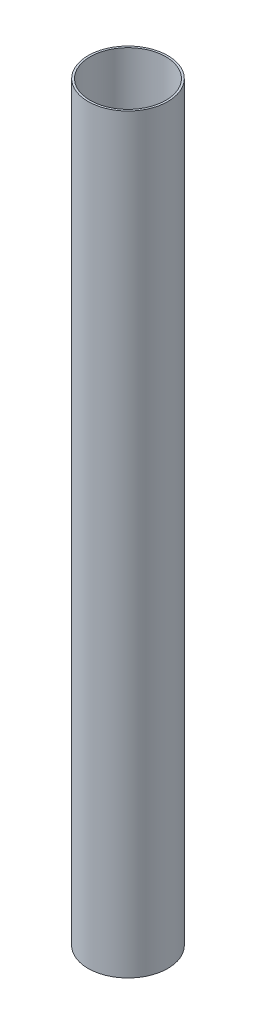
ISO-10303-21;
HEADER;
FILE_DESCRIPTION(('STEP AP214'),'2;1');
FILE_NAME('part.step','',(''),(''),'','','');
FILE_SCHEMA(('AUTOMOTIVE_DESIGN { 1 0 10303 214 1 1 1 1 }'));
ENDSEC;
DATA;
#1=APPLICATION_CONTEXT('core data for automotive mechanical design processes');
#2=APPLICATION_PROTOCOL_DEFINITION('international standard','automotive_design',2000,#1);
#3=PRODUCT_CONTEXT('',#1,'mechanical');
#4=PRODUCT('Part','Part','',(#3));
#5=PRODUCT_RELATED_PRODUCT_CATEGORY('part','',(#4));
#6=PRODUCT_DEFINITION_FORMATION('','',#4);
#7=PRODUCT_DEFINITION_CONTEXT('part definition',#1,'design');
#8=PRODUCT_DEFINITION('design','',#6,#7);
#9=PRODUCT_DEFINITION_SHAPE('','',#8);
#10=(LENGTH_UNIT() NAMED_UNIT(*) SI_UNIT(.MILLI.,.METRE.));
#11=(NAMED_UNIT(*) PLANE_ANGLE_UNIT() SI_UNIT($,.RADIAN.));
#12=(NAMED_UNIT(*) SI_UNIT($,.STERADIAN.) SOLID_ANGLE_UNIT());
#13=UNCERTAINTY_MEASURE_WITH_UNIT(LENGTH_MEASURE(1.E-05),#10,'distance_accuracy_value','');
#14=(GEOMETRIC_REPRESENTATION_CONTEXT(3) GLOBAL_UNCERTAINTY_ASSIGNED_CONTEXT((#13)) GLOBAL_UNIT_ASSIGNED_CONTEXT((#10,
#11,#12)) REPRESENTATION_CONTEXT('',''));
#15=CARTESIAN_POINT('',(0.,0.,0.));
#16=DIRECTION('',(0.,0.,1.));
#17=DIRECTION('',(1.,0.,0.));
#18=AXIS2_PLACEMENT_3D('',#15,#16,#17);
#19=CARTESIAN_POINT('',(0.,620.,0.));
#20=DIRECTION('',(0.,1.,0.));
#21=DIRECTION('',(0.,0.,1.));
#22=AXIS2_PLACEMENT_3D('',#19,#20,#21);
#23=PLANE('',#22);
#24=CARTESIAN_POINT('',(0.,620.,0.));
#25=DIRECTION('',(0.,1.,0.));
#26=DIRECTION('',(0.,0.,1.));
#27=AXIS2_PLACEMENT_3D('',#24,#25,#26);
#28=CIRCLE('',#27,32.9);
#29=CARTESIAN_POINT('',(0.,620.,32.9));
#30=VERTEX_POINT('',#29);
#31=EDGE_CURVE('E10',#30,#30,#28,.T.);
#32=ORIENTED_EDGE('',*,*,#31,.T.);
#33=EDGE_LOOP('',(#32));
#34=FACE_BOUND('',#33,.T.);
#35=CARTESIAN_POINT('',(0.,620.,0.));
#36=DIRECTION('',(0.,1.,0.));
#37=DIRECTION('',(0.,0.,1.));
#38=AXIS2_PLACEMENT_3D('',#35,#36,#37);
#39=CIRCLE('',#38,31.25);
#40=CARTESIAN_POINT('',(0.,620.,31.25));
#41=VERTEX_POINT('',#40);
#42=EDGE_CURVE('E42',#41,#41,#39,.T.);
#43=ORIENTED_EDGE('',*,*,#42,.F.);
#44=EDGE_LOOP('',(#43));
#45=FACE_BOUND('',#44,.T.);
#46=ADVANCED_FACE('F31',(#34,#45),#23,.T.);
#47=CARTESIAN_POINT('',(0.,0.,0.));
#48=DIRECTION('',(0.,1.,0.));
#49=DIRECTION('',(0.,0.,1.));
#50=AXIS2_PLACEMENT_3D('',#47,#48,#49);
#51=PLANE('',#50);
#52=CARTESIAN_POINT('',(0.,0.,0.));
#53=DIRECTION('',(0.,1.,0.));
#54=DIRECTION('',(0.,0.,1.));
#55=AXIS2_PLACEMENT_3D('',#52,#53,#54);
#56=CIRCLE('',#55,32.9);
#57=CARTESIAN_POINT('',(0.,0.,32.9));
#58=VERTEX_POINT('',#57);
#59=EDGE_CURVE('E35',#58,#58,#56,.T.);
#60=ORIENTED_EDGE('',*,*,#59,.F.);
#61=EDGE_LOOP('',(#60));
#62=FACE_BOUND('',#61,.T.);
#63=CARTESIAN_POINT('',(0.,0.,0.));
#64=DIRECTION('',(0.,1.,0.));
#65=DIRECTION('',(0.,0.,1.));
#66=AXIS2_PLACEMENT_3D('',#63,#64,#65);
#67=CIRCLE('',#66,31.25);
#68=CARTESIAN_POINT('',(0.,0.,31.25));
#69=VERTEX_POINT('',#68);
#70=EDGE_CURVE('E44',#69,#69,#67,.T.);
#71=ORIENTED_EDGE('',*,*,#70,.T.);
#72=EDGE_LOOP('',(#71));
#73=FACE_BOUND('',#72,.T.);
#74=ADVANCED_FACE('F54',(#62,#73),#51,.F.);
#75=CARTESIAN_POINT('',(0.,620.,0.));
#76=DIRECTION('',(0.,-1.,0.));
#77=DIRECTION('',(0.,0.,-1.));
#78=AXIS2_PLACEMENT_3D('',#75,#76,#77);
#79=CYLINDRICAL_SURFACE('',#78,32.9);
#80=ORIENTED_EDGE('',*,*,#31,.F.);
#81=EDGE_LOOP('',(#80));
#82=FACE_BOUND('',#81,.T.);
#83=ORIENTED_EDGE('',*,*,#59,.T.);
#84=EDGE_LOOP('',(#83));
#85=FACE_BOUND('',#84,.T.);
#86=ADVANCED_FACE('F33',(#82,#85),#79,.T.);
#87=CARTESIAN_POINT('',(0.,620.,0.));
#88=DIRECTION('',(0.,-1.,0.));
#89=DIRECTION('',(0.,0.,-1.));
#90=AXIS2_PLACEMENT_3D('',#87,#88,#89);
#91=CYLINDRICAL_SURFACE('',#90,31.25);
#92=ORIENTED_EDGE('',*,*,#42,.T.);
#93=EDGE_LOOP('',(#92));
#94=FACE_BOUND('',#93,.T.);
#95=ORIENTED_EDGE('',*,*,#70,.F.);
#96=EDGE_LOOP('',(#95));
#97=FACE_BOUND('',#96,.T.);
#98=ADVANCED_FACE('F50',(#94,#97),#91,.F.);
#99=CLOSED_SHELL('',(#46,#74,#86,#98));
#100=MANIFOLD_SOLID_BREP('B2',#99);
#101=ADVANCED_BREP_SHAPE_REPRESENTATION('',(#18,#100),#14);
#102=SHAPE_DEFINITION_REPRESENTATION(#9,#101);
ENDSEC;
END-ISO-10303-21;
